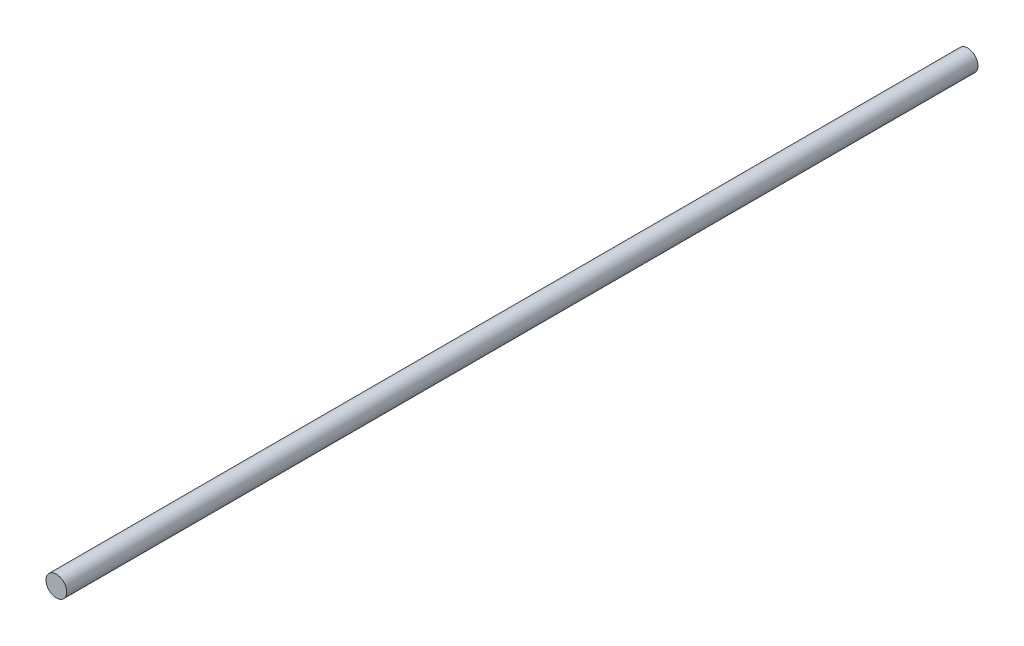
ISO-10303-21;
HEADER;
FILE_DESCRIPTION(('STEP AP214'),'2;1');
FILE_NAME('part.step','',(''),(''),'','','');
FILE_SCHEMA(('AUTOMOTIVE_DESIGN { 1 0 10303 214 1 1 1 1 }'));
ENDSEC;
DATA;
#1=APPLICATION_CONTEXT('core data for automotive mechanical design processes');
#2=APPLICATION_PROTOCOL_DEFINITION('international standard','automotive_design',2000,#1);
#3=PRODUCT_CONTEXT('',#1,'mechanical');
#4=PRODUCT('Part','Part','',(#3));
#5=PRODUCT_RELATED_PRODUCT_CATEGORY('part','',(#4));
#6=PRODUCT_DEFINITION_FORMATION('','',#4);
#7=PRODUCT_DEFINITION_CONTEXT('part definition',#1,'design');
#8=PRODUCT_DEFINITION('design','',#6,#7);
#9=PRODUCT_DEFINITION_SHAPE('','',#8);
#10=(LENGTH_UNIT() NAMED_UNIT(*) SI_UNIT(.MILLI.,.METRE.));
#11=(NAMED_UNIT(*) PLANE_ANGLE_UNIT() SI_UNIT($,.RADIAN.));
#12=(NAMED_UNIT(*) SI_UNIT($,.STERADIAN.) SOLID_ANGLE_UNIT());
#13=UNCERTAINTY_MEASURE_WITH_UNIT(LENGTH_MEASURE(1.E-05),#10,'distance_accuracy_value','');
#14=(GEOMETRIC_REPRESENTATION_CONTEXT(3) GLOBAL_UNCERTAINTY_ASSIGNED_CONTEXT((#13)) GLOBAL_UNIT_ASSIGNED_CONTEXT((#10,
#11,#12)) REPRESENTATION_CONTEXT('',''));
#15=CARTESIAN_POINT('',(0.,0.,0.));
#16=DIRECTION('',(0.,0.,1.));
#17=DIRECTION('',(1.,0.,0.));
#18=AXIS2_PLACEMENT_3D('',#15,#16,#17);
#19=CARTESIAN_POINT('',(0.,0.,1117.6));
#20=DIRECTION('',(0.,0.,-1.));
#21=DIRECTION('',(-1.,0.,0.));
#22=AXIS2_PLACEMENT_3D('',#19,#20,#21);
#23=CYLINDRICAL_SURFACE('',#22,12.7);
#24=CARTESIAN_POINT('',(0.,0.,1117.6));
#25=DIRECTION('',(0.,0.,1.));
#26=DIRECTION('',(1.,0.,0.));
#27=AXIS2_PLACEMENT_3D('',#24,#25,#26);
#28=CIRCLE('',#27,12.7);
#29=CARTESIAN_POINT('',(12.7,0.,1117.6));
#30=VERTEX_POINT('',#29);
#31=EDGE_CURVE('E10',#30,#30,#28,.T.);
#32=ORIENTED_EDGE('',*,*,#31,.F.);
#33=EDGE_LOOP('',(#32));
#34=FACE_BOUND('',#33,.T.);
#35=CARTESIAN_POINT('',(0.,0.,0.));
#36=DIRECTION('',(0.,0.,1.));
#37=DIRECTION('',(1.,0.,0.));
#38=AXIS2_PLACEMENT_3D('',#35,#36,#37);
#39=CIRCLE('',#38,12.7);
#40=CARTESIAN_POINT('',(12.7,0.,0.));
#41=VERTEX_POINT('',#40);
#42=EDGE_CURVE('E35',#41,#41,#39,.T.);
#43=ORIENTED_EDGE('',*,*,#42,.T.);
#44=EDGE_LOOP('',(#43));
#45=FACE_BOUND('',#44,.T.);
#46=ADVANCED_FACE('F32',(#34,#45),#23,.T.);
#47=CARTESIAN_POINT('',(0.,0.,1117.6));
#48=DIRECTION('',(0.,0.,1.));
#49=DIRECTION('',(1.,0.,0.));
#50=AXIS2_PLACEMENT_3D('',#47,#48,#49);
#51=PLANE('',#50);
#52=ORIENTED_EDGE('',*,*,#31,.T.);
#53=EDGE_LOOP('',(#52));
#54=FACE_BOUND('',#53,.T.);
#55=ADVANCED_FACE('F47',(#54),#51,.T.);
#56=CARTESIAN_POINT('',(0.,0.,0.));
#57=DIRECTION('',(0.,0.,1.));
#58=DIRECTION('',(1.,0.,0.));
#59=AXIS2_PLACEMENT_3D('',#56,#57,#58);
#60=PLANE('',#59);
#61=ORIENTED_EDGE('',*,*,#42,.F.);
#62=EDGE_LOOP('',(#61));
#63=FACE_BOUND('',#62,.T.);
#64=ADVANCED_FACE('F45',(#63),#60,.F.);
#65=CLOSED_SHELL('',(#46,#55,#64));
#66=MANIFOLD_SOLID_BREP('B2',#65);
#67=ADVANCED_BREP_SHAPE_REPRESENTATION('',(#18,#66),#14);
#68=SHAPE_DEFINITION_REPRESENTATION(#9,#67);
ENDSEC;
END-ISO-10303-21;
